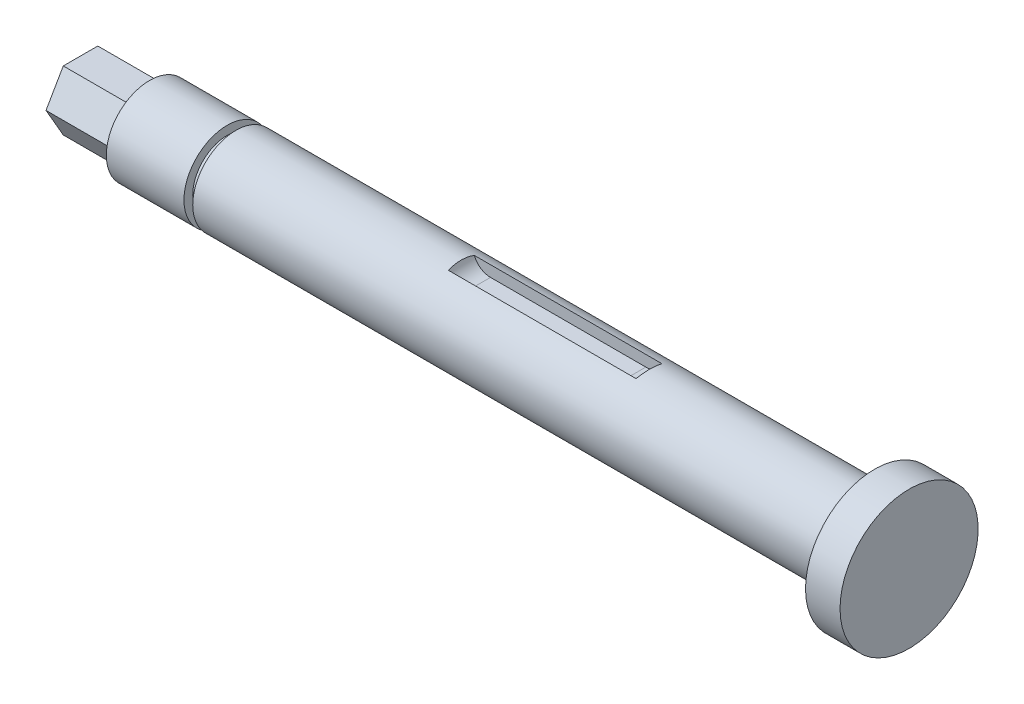
ISO-10303-21;
HEADER;
FILE_DESCRIPTION(('STEP AP214'),'2;1');
FILE_NAME('part.step','',(''),(''),'','','');
FILE_SCHEMA(('AUTOMOTIVE_DESIGN { 1 0 10303 214 1 1 1 1 }'));
ENDSEC;
DATA;
#1=APPLICATION_CONTEXT('core data for automotive mechanical design processes');
#2=APPLICATION_PROTOCOL_DEFINITION('international standard','automotive_design',2000,#1);
#3=PRODUCT_CONTEXT('',#1,'mechanical');
#4=PRODUCT('Part','Part','',(#3));
#5=PRODUCT_RELATED_PRODUCT_CATEGORY('part','',(#4));
#6=PRODUCT_DEFINITION_FORMATION('','',#4);
#7=PRODUCT_DEFINITION_CONTEXT('part definition',#1,'design');
#8=PRODUCT_DEFINITION('design','',#6,#7);
#9=PRODUCT_DEFINITION_SHAPE('','',#8);
#10=(LENGTH_UNIT() NAMED_UNIT(*) SI_UNIT(.MILLI.,.METRE.));
#11=(NAMED_UNIT(*) PLANE_ANGLE_UNIT() SI_UNIT($,.RADIAN.));
#12=(NAMED_UNIT(*) SI_UNIT($,.STERADIAN.) SOLID_ANGLE_UNIT());
#13=UNCERTAINTY_MEASURE_WITH_UNIT(LENGTH_MEASURE(1.E-05),#10,'distance_accuracy_value','');
#14=(GEOMETRIC_REPRESENTATION_CONTEXT(3) GLOBAL_UNCERTAINTY_ASSIGNED_CONTEXT((#13)) GLOBAL_UNIT_ASSIGNED_CONTEXT((#10,
#11,#12)) REPRESENTATION_CONTEXT('',''));
#15=CARTESIAN_POINT('',(0.,0.,0.));
#16=DIRECTION('',(0.,0.,1.));
#17=DIRECTION('',(1.,0.,0.));
#18=AXIS2_PLACEMENT_3D('',#15,#16,#17);
#19=CARTESIAN_POINT('',(-28.2307228915662,0.,0.));
#20=DIRECTION('',(-1.,0.,0.));
#21=DIRECTION('',(0.,0.,1.));
#22=AXIS2_PLACEMENT_3D('',#19,#20,#21);
#23=CYLINDRICAL_SURFACE('',#22,7.93750000000003);
#24=CARTESIAN_POINT('',(146.05,0.,0.));
#25=DIRECTION('',(-1.,0.,0.));
#26=DIRECTION('',(0.,0.,1.));
#27=AXIS2_PLACEMENT_3D('',#24,#25,#26);
#28=CIRCLE('',#27,7.93750000000004);
#29=CARTESIAN_POINT('',(146.05,0.,7.93750000000004));
#30=VERTEX_POINT('',#29);
#31=EDGE_CURVE('E196',#30,#30,#28,.T.);
#32=ORIENTED_EDGE('',*,*,#31,.T.);
#33=EDGE_LOOP('',(#32));
#34=FACE_BOUND('',#33,.T.);
#35=CARTESIAN_POINT('',(28.575,0.,0.));
#36=DIRECTION('',(-1.,0.,0.));
#37=DIRECTION('',(0.,0.,1.));
#38=AXIS2_PLACEMENT_3D('',#35,#36,#37);
#39=CIRCLE('',#38,7.93750000000002);
#40=CARTESIAN_POINT('',(28.575,0.,7.93750000000002));
#41=VERTEX_POINT('',#40);
#42=EDGE_CURVE('E193',#41,#41,#39,.T.);
#43=ORIENTED_EDGE('',*,*,#42,.F.);
#44=EDGE_LOOP('',(#43));
#45=FACE_BOUND('',#44,.T.);
#46=DIRECTION('',(-1.,0.,0.));
#47=VECTOR('',#46,1.);
#48=CARTESIAN_POINT('',(-28.2307228915662,7.57189241124704,-2.38125));
#49=LINE('',#48,#47);
#50=CARTESIAN_POINT('',(104.558242468135,7.57189241124704,-2.38125));
#51=VERTEX_POINT('',#50);
#52=CARTESIAN_POINT('',(70.0667575318649,7.57189241124704,-2.38125));
#53=VERTEX_POINT('',#52);
#54=EDGE_CURVE('E12',#51,#53,#49,.T.);
#55=ORIENTED_EDGE('',*,*,#54,.F.);
#56=CARTESIAN_POINT('',(104.558242468135,7.57189241124704,-2.38125));
#57=CARTESIAN_POINT('',(104.570292299634,7.60283748159564,-2.28286114644571));
#58=CARTESIAN_POINT('',(104.581072133761,7.63190103640769,-2.18373394589652));
#59=CARTESIAN_POINT('',(104.600423195045,7.68618284099059,-1.98423094459988));
#60=CARTESIAN_POINT('',(104.608994688707,7.71140155461099,-1.88385529605055));
#61=CARTESIAN_POINT('',(104.624259395623,7.75790730479952,-1.68210998868868));
#62=CARTESIAN_POINT('',(104.630953544207,7.77919629741936,-1.58074085099974));
#63=CARTESIAN_POINT('',(104.64273036696,7.81780480710205,-1.37716069329767));
#64=CARTESIAN_POINT('',(104.647812995253,7.83512421116127,-1.27494964940349));
#65=CARTESIAN_POINT('',(104.660759114225,7.8802878319986,-0.972518602068035));
#66=CARTESIAN_POINT('',(104.66668372953,7.90252061667358,-0.771346365920771));
#67=CARTESIAN_POINT('',(104.674320578914,7.93155475211322,-0.36781219202663));
#68=CARTESIAN_POINT('',(104.676032260968,7.9383540806034,-0.165450101853533));
#69=CARTESIAN_POINT('',(104.675557224375,7.93650243379862,0.233209512953251));
#70=CARTESIAN_POINT('',(104.673484295205,7.9283024201171,0.429509408207372));
#71=CARTESIAN_POINT('',(104.665305250642,7.89737846148742,0.820870390108015));
#72=CARTESIAN_POINT('',(104.659199841214,7.8746570588152,1.01593168756149));
#73=CARTESIAN_POINT('',(104.64615113362,7.82945029286185,1.30909544958883));
#74=CARTESIAN_POINT('',(104.641066118128,7.81224594563474,1.40812396106606));
#75=CARTESIAN_POINT('',(104.629359958228,7.77410905883624,1.60537279101093));
#76=CARTESIAN_POINT('',(104.622738856021,7.75317662169133,1.70359313160494));
#77=CARTESIAN_POINT('',(104.607714834745,7.7076215464084,1.89909267282387));
#78=CARTESIAN_POINT('',(104.599310976331,7.6829969648705,1.99637134891407));
#79=CARTESIAN_POINT('',(104.580417447224,7.63013554179117,2.18974831448237));
#80=CARTESIAN_POINT('',(104.569927539933,7.60189829063227,2.28584646875236));
#81=CARTESIAN_POINT('',(104.558242468135,7.57189241124704,2.38125));
#82=B_SPLINE_CURVE_WITH_KNOTS('',3,(#56,#57,#58,#59,#60,#61,#62,#63,#64,#65,#66,#67,#68,#69,#70,
#71,#72,#73,#74,#75,#76,#77,#78,#79,#80,#81),.UNSPECIFIED.,.F.,.F.,(4,2,2,2,2,2,2,2,2,2,2,2,4),
(0.,0.311486004627486,0.622934401155597,0.934227351103232,1.24552916163333,1.85227877141675,
2.45910788014202,3.04799138422072,3.63677182003086,3.93862384263225,4.24046757335365,
4.54247074416797,4.8445081875833),.UNSPECIFIED.);
#83=CARTESIAN_POINT('',(104.558242468135,7.57189241124704,2.38125));
#84=VERTEX_POINT('',#83);
#85=EDGE_CURVE('E46',#51,#84,#82,.T.);
#86=ORIENTED_EDGE('',*,*,#85,.T.);
#87=DIRECTION('',(-1.,0.,0.));
#88=VECTOR('',#87,1.);
#89=CARTESIAN_POINT('',(-28.2307228915662,7.57189241124704,2.38125));
#90=LINE('',#89,#88);
#91=CARTESIAN_POINT('',(70.0667575318649,7.57189241124704,2.38125));
#92=VERTEX_POINT('',#91);
#93=EDGE_CURVE('E205',#84,#92,#90,.T.);
#94=ORIENTED_EDGE('',*,*,#93,.T.);
#95=CARTESIAN_POINT('',(70.0667575318649,7.57189241124704,2.38125));
#96=CARTESIAN_POINT('',(70.0547077003656,7.60283748159564,2.2828611464457));
#97=CARTESIAN_POINT('',(70.0439278662388,7.63190103640769,2.18373394589652));
#98=CARTESIAN_POINT('',(70.0245768049551,7.68618284099059,1.98423094459987));
#99=CARTESIAN_POINT('',(70.0160053112933,7.71140155461099,1.88385529605055));
#100=CARTESIAN_POINT('',(70.0007406043774,7.75790730479952,1.68210998868868));
#101=CARTESIAN_POINT('',(69.9940464557926,7.77919629741936,1.58074085099974));
#102=CARTESIAN_POINT('',(69.9822696330403,7.81780480710205,1.37716069329767));
#103=CARTESIAN_POINT('',(69.9771870047471,7.83512421116127,1.27494964940349));
#104=CARTESIAN_POINT('',(69.9642408857745,7.8802878319986,0.972518602068035));
#105=CARTESIAN_POINT('',(69.9583162704699,7.90252061667358,0.771346365920772));
#106=CARTESIAN_POINT('',(69.9506794210857,7.93155475211322,0.367812192026633));
#107=CARTESIAN_POINT('',(69.9489677390323,7.93835408060341,0.165450101853536));
#108=CARTESIAN_POINT('',(69.949442775625,7.93650243379862,-0.233209512953248));
#109=CARTESIAN_POINT('',(69.9515157047947,7.9283024201171,-0.429509408207369));
#110=CARTESIAN_POINT('',(69.9596947493576,7.89737846148742,-0.820870390108013));
#111=CARTESIAN_POINT('',(69.9658001587861,7.8746570588152,-1.01593168756149));
#112=CARTESIAN_POINT('',(69.9788488663797,7.82945029286185,-1.30909544958883));
#113=CARTESIAN_POINT('',(69.9839338818715,7.81224594563474,-1.40812396106606));
#114=CARTESIAN_POINT('',(69.9956400417717,7.77410905883624,-1.60537279101094));
#115=CARTESIAN_POINT('',(70.0022611439788,7.75317662169133,-1.70359313160494));
#116=CARTESIAN_POINT('',(70.0172851652547,7.7076215464084,-1.89909267282387));
#117=CARTESIAN_POINT('',(70.0256890236686,7.6829969648705,-1.99637134891408));
#118=CARTESIAN_POINT('',(70.0445825527755,7.63013554179117,-2.18974831448237));
#119=CARTESIAN_POINT('',(70.0550724600671,7.60189829063227,-2.28584646875236));
#120=CARTESIAN_POINT('',(70.0667575318649,7.57189241124704,-2.38125));
#121=B_SPLINE_CURVE_WITH_KNOTS('',3,(#95,#96,#97,#98,#99,#100,#101,#102,#103,#104,#105,#106,
#107,#108,#109,#110,#111,#112,#113,#114,#115,#116,#117,#118,#119,#120),.UNSPECIFIED.,.F.,.F.,(4,
2,2,2,2,2,2,2,2,2,2,2,4),(0.,0.311486004627486,0.622934401155596,0.934227351103231,
1.24552916163333,1.85227877141675,2.45910788014201,3.04799138422072,3.63677182003086,
3.93862384263225,4.24046757335365,4.54247074416797,4.84450818758329),.UNSPECIFIED.);
#122=EDGE_CURVE('E208',#92,#53,#121,.T.);
#123=ORIENTED_EDGE('',*,*,#122,.T.);
#124=EDGE_LOOP('',(#55,#86,#94,#123));
#125=FACE_BOUND('',#124,.T.);
#126=ADVANCED_FACE('F38',(#34,#45,#125),#23,.T.);
#127=CARTESIAN_POINT('',(152.4,0.,0.));
#128=DIRECTION('',(-1.,0.,0.));
#129=DIRECTION('',(0.,0.,1.));
#130=AXIS2_PLACEMENT_3D('',#127,#128,#129);
#131=PLANE('',#130);
#132=CARTESIAN_POINT('',(152.4,0.,0.));
#133=DIRECTION('',(-1.,0.,0.));
#134=DIRECTION('',(0.,0.,1.));
#135=AXIS2_PLACEMENT_3D('',#132,#133,#134);
#136=CIRCLE('',#135,12.7);
#137=CARTESIAN_POINT('',(152.4,0.,12.7));
#138=VERTEX_POINT('',#137);
#139=EDGE_CURVE('E202',#138,#138,#136,.T.);
#140=ORIENTED_EDGE('',*,*,#139,.F.);
#141=EDGE_LOOP('',(#140));
#142=FACE_BOUND('',#141,.T.);
#143=ADVANCED_FACE('F256',(#142),#131,.F.);
#144=CARTESIAN_POINT('',(-28.2307228915662,0.,0.));
#145=DIRECTION('',(-1.,0.,0.));
#146=DIRECTION('',(0.,0.,1.));
#147=AXIS2_PLACEMENT_3D('',#144,#145,#146);
#148=CYLINDRICAL_SURFACE('',#147,12.7);
#149=CARTESIAN_POINT('',(146.05,0.,0.));
#150=DIRECTION('',(-1.,0.,0.));
#151=DIRECTION('',(0.,0.,1.));
#152=AXIS2_PLACEMENT_3D('',#149,#150,#151);
#153=CIRCLE('',#152,12.7);
#154=CARTESIAN_POINT('',(146.05,0.,12.7));
#155=VERTEX_POINT('',#154);
#156=EDGE_CURVE('E199',#155,#155,#153,.T.);
#157=ORIENTED_EDGE('',*,*,#156,.F.);
#158=EDGE_LOOP('',(#157));
#159=FACE_BOUND('',#158,.T.);
#160=ORIENTED_EDGE('',*,*,#139,.T.);
#161=EDGE_LOOP('',(#160));
#162=FACE_BOUND('',#161,.T.);
#163=ADVANCED_FACE('F251',(#159,#162),#148,.T.);
#164=CARTESIAN_POINT('',(146.05,12.7,0.));
#165=DIRECTION('',(1.,0.,0.));
#166=DIRECTION('',(0.,0.,-1.));
#167=AXIS2_PLACEMENT_3D('',#164,#165,#166);
#168=PLANE('',#167);
#169=ORIENTED_EDGE('',*,*,#31,.F.);
#170=EDGE_LOOP('',(#169));
#171=FACE_BOUND('',#170,.T.);
#172=ORIENTED_EDGE('',*,*,#156,.T.);
#173=EDGE_LOOP('',(#172));
#174=FACE_BOUND('',#173,.T.);
#175=ADVANCED_FACE('F246',(#171,#174),#168,.F.);
#176=CARTESIAN_POINT('',(28.575,7.93750000000002,0.));
#177=DIRECTION('',(1.,0.,0.));
#178=DIRECTION('',(0.,0.,-1.));
#179=AXIS2_PLACEMENT_3D('',#176,#177,#178);
#180=PLANE('',#179);
#181=CARTESIAN_POINT('',(28.575,0.,0.));
#182=DIRECTION('',(-1.,0.,0.));
#183=DIRECTION('',(0.,0.,1.));
#184=AXIS2_PLACEMENT_3D('',#181,#182,#183);
#185=CIRCLE('',#184,6.33730000000002);
#186=CARTESIAN_POINT('',(28.575,0.,6.33730000000002));
#187=VERTEX_POINT('',#186);
#188=EDGE_CURVE('E190',#187,#187,#185,.T.);
#189=ORIENTED_EDGE('',*,*,#188,.F.);
#190=EDGE_LOOP('',(#189));
#191=FACE_BOUND('',#190,.T.);
#192=ORIENTED_EDGE('',*,*,#42,.T.);
#193=EDGE_LOOP('',(#192));
#194=FACE_BOUND('',#193,.T.);
#195=ADVANCED_FACE('F243',(#191,#194),#180,.F.);
#196=CARTESIAN_POINT('',(-28.2307228915662,0.,0.));
#197=DIRECTION('',(-1.,0.,0.));
#198=DIRECTION('',(0.,0.,1.));
#199=AXIS2_PLACEMENT_3D('',#196,#197,#198);
#200=CYLINDRICAL_SURFACE('',#199,6.33730000000002);
#201=CARTESIAN_POINT('',(26.9748,0.,0.));
#202=DIRECTION('',(-1.,0.,0.));
#203=DIRECTION('',(0.,0.,1.));
#204=AXIS2_PLACEMENT_3D('',#201,#202,#203);
#205=CIRCLE('',#204,6.33730000000002);
#206=CARTESIAN_POINT('',(26.9748,0.,6.33730000000002));
#207=VERTEX_POINT('',#206);
#208=EDGE_CURVE('E187',#207,#207,#205,.T.);
#209=ORIENTED_EDGE('',*,*,#208,.F.);
#210=EDGE_LOOP('',(#209));
#211=FACE_BOUND('',#210,.T.);
#212=ORIENTED_EDGE('',*,*,#188,.T.);
#213=EDGE_LOOP('',(#212));
#214=FACE_BOUND('',#213,.T.);
#215=ADVANCED_FACE('F240',(#211,#214),#200,.T.);
#216=CARTESIAN_POINT('',(26.9748,6.33730000000002,0.));
#217=DIRECTION('',(-1.,0.,0.));
#218=DIRECTION('',(0.,0.,1.));
#219=AXIS2_PLACEMENT_3D('',#216,#217,#218);
#220=PLANE('',#219);
#221=CARTESIAN_POINT('',(26.9748,0.,0.));
#222=DIRECTION('',(-1.,0.,0.));
#223=DIRECTION('',(0.,0.,1.));
#224=AXIS2_PLACEMENT_3D('',#221,#222,#223);
#225=CIRCLE('',#224,7.95020000000001);
#226=CARTESIAN_POINT('',(26.9748,0.,7.95020000000001));
#227=VERTEX_POINT('',#226);
#228=EDGE_CURVE('E184',#227,#227,#225,.T.);
#229=ORIENTED_EDGE('',*,*,#228,.F.);
#230=EDGE_LOOP('',(#229));
#231=FACE_BOUND('',#230,.T.);
#232=ORIENTED_EDGE('',*,*,#208,.T.);
#233=EDGE_LOOP('',(#232));
#234=FACE_BOUND('',#233,.T.);
#235=ADVANCED_FACE('F236',(#231,#234),#220,.F.);
#236=CARTESIAN_POINT('',(-28.2307228915662,0.,0.));
#237=DIRECTION('',(-1.,0.,0.));
#238=DIRECTION('',(0.,0.,1.));
#239=AXIS2_PLACEMENT_3D('',#236,#237,#238);
#240=CYLINDRICAL_SURFACE('',#239,7.9502);
#241=CARTESIAN_POINT('',(12.7,0.,0.));
#242=DIRECTION('',(-1.,0.,0.));
#243=DIRECTION('',(0.,0.,1.));
#244=AXIS2_PLACEMENT_3D('',#241,#242,#243);
#245=CIRCLE('',#244,7.9502);
#246=CARTESIAN_POINT('',(12.7,0.,7.9502));
#247=VERTEX_POINT('',#246);
#248=EDGE_CURVE('E179',#247,#247,#245,.T.);
#249=ORIENTED_EDGE('',*,*,#248,.F.);
#250=EDGE_LOOP('',(#249));
#251=FACE_BOUND('',#250,.T.);
#252=ORIENTED_EDGE('',*,*,#228,.T.);
#253=EDGE_LOOP('',(#252));
#254=FACE_BOUND('',#253,.T.);
#255=ADVANCED_FACE('F233',(#251,#254),#240,.T.);
#256=CARTESIAN_POINT('',(12.7,7.9502,0.));
#257=DIRECTION('',(1.,0.,0.));
#258=DIRECTION('',(0.,0.,-1.));
#259=AXIS2_PLACEMENT_3D('',#256,#257,#258);
#260=PLANE('',#259);
#261=DIRECTION('',(0.,-0.866025403784438,0.5));
#262=VECTOR('',#261,1.);
#263=CARTESIAN_POINT('',(12.7,0.,-6.35));
#264=LINE('',#263,#262);
#265=CARTESIAN_POINT('',(12.7,0.,-6.35));
#266=VERTEX_POINT('',#265);
#267=CARTESIAN_POINT('',(12.7,-5.49926131403118,-3.175));
#268=VERTEX_POINT('',#267);
#269=EDGE_CURVE('E145',#266,#268,#264,.T.);
#270=ORIENTED_EDGE('',*,*,#269,.F.);
#271=DIRECTION('',(0.,-0.866025403784439,-0.5));
#272=VECTOR('',#271,1.);
#273=CARTESIAN_POINT('',(12.7,5.49926131403118,-3.175));
#274=LINE('',#273,#272);
#275=CARTESIAN_POINT('',(12.7,5.49926131403118,-3.175));
#276=VERTEX_POINT('',#275);
#277=EDGE_CURVE('E53',#276,#266,#274,.T.);
#278=ORIENTED_EDGE('',*,*,#277,.F.);
#279=DIRECTION('',(0.,0.,-1.));
#280=VECTOR('',#279,1.);
#281=CARTESIAN_POINT('',(12.7,5.49926131403118,3.175));
#282=LINE('',#281,#280);
#283=CARTESIAN_POINT('',(12.7,5.49926131403118,3.175));
#284=VERTEX_POINT('',#283);
#285=EDGE_CURVE('E116',#284,#276,#282,.T.);
#286=ORIENTED_EDGE('',*,*,#285,.F.);
#287=DIRECTION('',(0.,0.866025403784438,-0.5));
#288=VECTOR('',#287,1.);
#289=CARTESIAN_POINT('',(12.7,0.,6.35));
#290=LINE('',#289,#288);
#291=CARTESIAN_POINT('',(12.7,0.,6.35));
#292=VERTEX_POINT('',#291);
#293=EDGE_CURVE('E128',#292,#284,#290,.T.);
#294=ORIENTED_EDGE('',*,*,#293,.F.);
#295=DIRECTION('',(0.,0.866025403784439,0.5));
#296=VECTOR('',#295,1.);
#297=CARTESIAN_POINT('',(12.7,-5.49926131403118,3.175));
#298=LINE('',#297,#296);
#299=CARTESIAN_POINT('',(12.7,-5.49926131403118,3.175));
#300=VERTEX_POINT('',#299);
#301=EDGE_CURVE('E134',#300,#292,#298,.T.);
#302=ORIENTED_EDGE('',*,*,#301,.F.);
#303=DIRECTION('',(0.,0.,1.));
#304=VECTOR('',#303,1.);
#305=CARTESIAN_POINT('',(12.7,-5.49926131403118,-3.175));
#306=LINE('',#305,#304);
#307=EDGE_CURVE('E141',#268,#300,#306,.T.);
#308=ORIENTED_EDGE('',*,*,#307,.F.);
#309=EDGE_LOOP('',(#270,#278,#286,#294,#302,#308));
#310=FACE_BOUND('',#309,.T.);
#311=ORIENTED_EDGE('',*,*,#248,.T.);
#312=EDGE_LOOP('',(#311));
#313=FACE_BOUND('',#312,.T.);
#314=ADVANCED_FACE('F126',(#310,#313),#260,.F.);
#315=CARTESIAN_POINT('',(101.6,8.72490000000003,-2.38125));
#316=DIRECTION('',(0.,0.,1.));
#317=DIRECTION('',(1.,0.,0.));
#318=AXIS2_PLACEMENT_3D('',#315,#316,#317);
#319=CYLINDRICAL_SURFACE('',#318,3.175);
#320=CARTESIAN_POINT('',(101.6,8.72490000000003,-2.38125));
#321=DIRECTION('',(0.,0.,1.));
#322=DIRECTION('',(-1.,0.,0.));
#323=AXIS2_PLACEMENT_3D('',#320,#321,#322);
#324=CIRCLE('',#323,3.175);
#325=CARTESIAN_POINT('',(101.6,5.54990000000003,-2.38125));
#326=VERTEX_POINT('',#325);
#327=EDGE_CURVE('E167',#326,#51,#324,.T.);
#328=ORIENTED_EDGE('',*,*,#327,.F.);
#329=DIRECTION('',(0.,0.,1.));
#330=VECTOR('',#329,1.);
#331=CARTESIAN_POINT('',(101.6,5.54990000000003,-2.38125));
#332=LINE('',#331,#330);
#333=CARTESIAN_POINT('',(101.6,5.54990000000003,2.38125));
#334=VERTEX_POINT('',#333);
#335=EDGE_CURVE('E177',#326,#334,#332,.T.);
#336=ORIENTED_EDGE('',*,*,#335,.T.);
#337=CARTESIAN_POINT('',(101.6,8.72490000000003,2.38125));
#338=DIRECTION('',(0.,0.,1.));
#339=DIRECTION('',(-1.,0.,0.));
#340=AXIS2_PLACEMENT_3D('',#337,#338,#339);
#341=CIRCLE('',#340,3.175);
#342=EDGE_CURVE('E164',#334,#84,#341,.T.);
#343=ORIENTED_EDGE('',*,*,#342,.T.);
#344=ORIENTED_EDGE('',*,*,#85,.F.);
#345=EDGE_LOOP('',(#328,#336,#343,#344));
#346=FACE_BOUND('',#345,.T.);
#347=ADVANCED_FACE('F228',(#346),#319,.F.);
#348=CARTESIAN_POINT('',(73.025,8.72490000000003,-2.38125));
#349=DIRECTION('',(0.,0.,1.));
#350=DIRECTION('',(1.,0.,0.));
#351=AXIS2_PLACEMENT_3D('',#348,#349,#350);
#352=CYLINDRICAL_SURFACE('',#351,3.17500000000001);
#353=CARTESIAN_POINT('',(73.025,8.72490000000003,2.38125));
#354=DIRECTION('',(0.,0.,1.));
#355=DIRECTION('',(1.,0.,0.));
#356=AXIS2_PLACEMENT_3D('',#353,#354,#355);
#357=CIRCLE('',#356,3.17500000000001);
#358=CARTESIAN_POINT('',(73.025,5.54990000000003,2.38125));
#359=VERTEX_POINT('',#358);
#360=EDGE_CURVE('E144',#92,#359,#357,.T.);
#361=ORIENTED_EDGE('',*,*,#360,.T.);
#362=DIRECTION('',(0.,0.,1.));
#363=VECTOR('',#362,1.);
#364=CARTESIAN_POINT('',(73.025,5.54990000000003,-2.38125));
#365=LINE('',#364,#363);
#366=CARTESIAN_POINT('',(73.025,5.54990000000003,-2.38125));
#367=VERTEX_POINT('',#366);
#368=EDGE_CURVE('E170',#367,#359,#365,.T.);
#369=ORIENTED_EDGE('',*,*,#368,.F.);
#370=CARTESIAN_POINT('',(73.025,8.72490000000003,-2.38125));
#371=DIRECTION('',(0.,0.,1.));
#372=DIRECTION('',(1.,0.,0.));
#373=AXIS2_PLACEMENT_3D('',#370,#371,#372);
#374=CIRCLE('',#373,3.17500000000001);
#375=EDGE_CURVE('E161',#53,#367,#374,.T.);
#376=ORIENTED_EDGE('',*,*,#375,.F.);
#377=ORIENTED_EDGE('',*,*,#122,.F.);
#378=EDGE_LOOP('',(#361,#369,#376,#377));
#379=FACE_BOUND('',#378,.T.);
#380=ADVANCED_FACE('F222',(#379),#352,.F.);
#381=CARTESIAN_POINT('',(73.025,8.72490000000003,-2.38125));
#382=DIRECTION('',(0.,0.,1.));
#383=DIRECTION('',(1.,0.,0.));
#384=AXIS2_PLACEMENT_3D('',#381,#382,#383);
#385=PLANE('',#384);
#386=ORIENTED_EDGE('',*,*,#54,.T.);
#387=ORIENTED_EDGE('',*,*,#375,.T.);
#388=DIRECTION('',(1.,0.,0.));
#389=VECTOR('',#388,1.);
#390=CARTESIAN_POINT('',(101.6,5.54990000000003,-2.38125));
#391=LINE('',#390,#389);
#392=EDGE_CURVE('E163',#367,#326,#391,.T.);
#393=ORIENTED_EDGE('',*,*,#392,.T.);
#394=ORIENTED_EDGE('',*,*,#327,.T.);
#395=EDGE_LOOP('',(#386,#387,#393,#394));
#396=FACE_BOUND('',#395,.T.);
#397=ADVANCED_FACE('F227',(#396),#385,.T.);
#398=CARTESIAN_POINT('',(73.025,8.72490000000003,2.38125));
#399=DIRECTION('',(0.,0.,1.));
#400=DIRECTION('',(1.,0.,0.));
#401=AXIS2_PLACEMENT_3D('',#398,#399,#400);
#402=PLANE('',#401);
#403=ORIENTED_EDGE('',*,*,#342,.F.);
#404=DIRECTION('',(1.,0.,0.));
#405=VECTOR('',#404,1.);
#406=CARTESIAN_POINT('',(101.6,5.54990000000003,2.38125));
#407=LINE('',#406,#405);
#408=EDGE_CURVE('E172',#359,#334,#407,.T.);
#409=ORIENTED_EDGE('',*,*,#408,.F.);
#410=ORIENTED_EDGE('',*,*,#360,.F.);
#411=ORIENTED_EDGE('',*,*,#93,.F.);
#412=EDGE_LOOP('',(#403,#409,#410,#411));
#413=FACE_BOUND('',#412,.T.);
#414=ADVANCED_FACE('F279',(#413),#402,.F.);
#415=CARTESIAN_POINT('',(101.6,5.54990000000003,-2.38125));
#416=DIRECTION('',(0.,-1.,0.));
#417=DIRECTION('',(0.,0.,-1.));
#418=AXIS2_PLACEMENT_3D('',#415,#416,#417);
#419=PLANE('',#418);
#420=ORIENTED_EDGE('',*,*,#408,.T.);
#421=ORIENTED_EDGE('',*,*,#335,.F.);
#422=ORIENTED_EDGE('',*,*,#392,.F.);
#423=ORIENTED_EDGE('',*,*,#368,.T.);
#424=EDGE_LOOP('',(#420,#421,#422,#423));
#425=FACE_BOUND('',#424,.T.);
#426=ADVANCED_FACE('F230',(#425),#419,.F.);
#427=CARTESIAN_POINT('',(56.5795209628124,0.,6.35));
#428=DIRECTION('',(0.,0.5,0.866025403784438));
#429=DIRECTION('',(0.,-0.866025403784438,0.5));
#430=AXIS2_PLACEMENT_3D('',#427,#428,#429);
#431=PLANE('',#430);
#432=ORIENTED_EDGE('',*,*,#293,.T.);
#433=DIRECTION('',(-1.,0.,0.));
#434=VECTOR('',#433,1.);
#435=CARTESIAN_POINT('',(56.5795209628124,5.49926131403118,3.175));
#436=LINE('',#435,#434);
#437=CARTESIAN_POINT('',(0.,5.49926131403118,3.175));
#438=VERTEX_POINT('',#437);
#439=EDGE_CURVE('E113',#284,#438,#436,.T.);
#440=ORIENTED_EDGE('',*,*,#439,.T.);
#441=DIRECTION('',(0.,0.866025403784438,-0.5));
#442=VECTOR('',#441,1.);
#443=CARTESIAN_POINT('',(0.,0.,6.35));
#444=LINE('',#443,#442);
#445=CARTESIAN_POINT('',(0.,0.,6.35));
#446=VERTEX_POINT('',#445);
#447=EDGE_CURVE('E138',#446,#438,#444,.T.);
#448=ORIENTED_EDGE('',*,*,#447,.F.);
#449=DIRECTION('',(-1.,0.,0.));
#450=VECTOR('',#449,1.);
#451=CARTESIAN_POINT('',(56.5795209628124,0.,6.35));
#452=LINE('',#451,#450);
#453=EDGE_CURVE('E132',#292,#446,#452,.T.);
#454=ORIENTED_EDGE('',*,*,#453,.F.);
#455=EDGE_LOOP('',(#432,#440,#448,#454));
#456=FACE_BOUND('',#455,.T.);
#457=ADVANCED_FACE('F131',(#456),#431,.T.);
#458=CARTESIAN_POINT('',(56.5795209628124,-5.49926131403118,3.175));
#459=DIRECTION('',(0.,-0.5,0.866025403784439));
#460=DIRECTION('',(0.,-0.866025403784439,-0.5));
#461=AXIS2_PLACEMENT_3D('',#458,#459,#460);
#462=PLANE('',#461);
#463=ORIENTED_EDGE('',*,*,#301,.T.);
#464=ORIENTED_EDGE('',*,*,#453,.T.);
#465=DIRECTION('',(0.,0.866025403784439,0.5));
#466=VECTOR('',#465,1.);
#467=CARTESIAN_POINT('',(0.,-5.49926131403118,3.175));
#468=LINE('',#467,#466);
#469=CARTESIAN_POINT('',(0.,-5.49926131403118,3.175));
#470=VERTEX_POINT('',#469);
#471=EDGE_CURVE('E152',#470,#446,#468,.T.);
#472=ORIENTED_EDGE('',*,*,#471,.F.);
#473=DIRECTION('',(-1.,0.,0.));
#474=VECTOR('',#473,1.);
#475=CARTESIAN_POINT('',(56.5795209628124,-5.49926131403118,3.175));
#476=LINE('',#475,#474);
#477=EDGE_CURVE('E150',#300,#470,#476,.T.);
#478=ORIENTED_EDGE('',*,*,#477,.F.);
#479=EDGE_LOOP('',(#463,#464,#472,#478));
#480=FACE_BOUND('',#479,.T.);
#481=ADVANCED_FACE('F327',(#480),#462,.T.);
#482=CARTESIAN_POINT('',(56.5795209628124,-5.49926131403118,-3.175));
#483=DIRECTION('',(0.,-1.,0.));
#484=DIRECTION('',(0.,0.,-1.));
#485=AXIS2_PLACEMENT_3D('',#482,#483,#484);
#486=PLANE('',#485);
#487=ORIENTED_EDGE('',*,*,#307,.T.);
#488=ORIENTED_EDGE('',*,*,#477,.T.);
#489=DIRECTION('',(0.,0.,1.));
#490=VECTOR('',#489,1.);
#491=CARTESIAN_POINT('',(0.,-5.49926131403118,-3.175));
#492=LINE('',#491,#490);
#493=CARTESIAN_POINT('',(0.,-5.49926131403118,-3.175));
#494=VERTEX_POINT('',#493);
#495=EDGE_CURVE('E155',#494,#470,#492,.T.);
#496=ORIENTED_EDGE('',*,*,#495,.F.);
#497=DIRECTION('',(-1.,0.,0.));
#498=VECTOR('',#497,1.);
#499=CARTESIAN_POINT('',(56.5795209628124,-5.49926131403118,-3.175));
#500=LINE('',#499,#498);
#501=EDGE_CURVE('E153',#268,#494,#500,.T.);
#502=ORIENTED_EDGE('',*,*,#501,.F.);
#503=EDGE_LOOP('',(#487,#488,#496,#502));
#504=FACE_BOUND('',#503,.T.);
#505=ADVANCED_FACE('F335',(#504),#486,.T.);
#506=CARTESIAN_POINT('',(56.5795209628124,0.,-6.35));
#507=DIRECTION('',(0.,-0.5,-0.866025403784438));
#508=DIRECTION('',(0.,0.866025403784438,-0.5));
#509=AXIS2_PLACEMENT_3D('',#506,#507,#508);
#510=PLANE('',#509);
#511=ORIENTED_EDGE('',*,*,#269,.T.);
#512=ORIENTED_EDGE('',*,*,#501,.T.);
#513=DIRECTION('',(0.,-0.866025403784438,0.5));
#514=VECTOR('',#513,1.);
#515=CARTESIAN_POINT('',(0.,0.,-6.35));
#516=LINE('',#515,#514);
#517=CARTESIAN_POINT('',(0.,0.,-6.35));
#518=VERTEX_POINT('',#517);
#519=EDGE_CURVE('E158',#518,#494,#516,.T.);
#520=ORIENTED_EDGE('',*,*,#519,.F.);
#521=DIRECTION('',(-1.,0.,0.));
#522=VECTOR('',#521,1.);
#523=CARTESIAN_POINT('',(56.5795209628124,0.,-6.35));
#524=LINE('',#523,#522);
#525=EDGE_CURVE('E156',#266,#518,#524,.T.);
#526=ORIENTED_EDGE('',*,*,#525,.F.);
#527=EDGE_LOOP('',(#511,#512,#520,#526));
#528=FACE_BOUND('',#527,.T.);
#529=ADVANCED_FACE('F345',(#528),#510,.T.);
#530=CARTESIAN_POINT('',(56.5795209628124,5.49926131403118,-3.175));
#531=DIRECTION('',(0.,0.5,-0.866025403784439));
#532=DIRECTION('',(0.,0.866025403784439,0.5));
#533=AXIS2_PLACEMENT_3D('',#530,#531,#532);
#534=PLANE('',#533);
#535=ORIENTED_EDGE('',*,*,#277,.T.);
#536=ORIENTED_EDGE('',*,*,#525,.T.);
#537=DIRECTION('',(0.,-0.866025403784439,-0.5));
#538=VECTOR('',#537,1.);
#539=CARTESIAN_POINT('',(0.,5.49926131403118,-3.175));
#540=LINE('',#539,#538);
#541=CARTESIAN_POINT('',(0.,5.49926131403118,-3.175));
#542=VERTEX_POINT('',#541);
#543=EDGE_CURVE('E58',#542,#518,#540,.T.);
#544=ORIENTED_EDGE('',*,*,#543,.F.);
#545=DIRECTION('',(-1.,0.,0.));
#546=VECTOR('',#545,1.);
#547=CARTESIAN_POINT('',(56.5795209628124,5.49926131403118,-3.175));
#548=LINE('',#547,#546);
#549=EDGE_CURVE('E159',#276,#542,#548,.T.);
#550=ORIENTED_EDGE('',*,*,#549,.F.);
#551=EDGE_LOOP('',(#535,#536,#544,#550));
#552=FACE_BOUND('',#551,.T.);
#553=ADVANCED_FACE('F355',(#552),#534,.T.);
#554=CARTESIAN_POINT('',(56.5795209628124,5.49926131403118,3.175));
#555=DIRECTION('',(0.,1.,0.));
#556=DIRECTION('',(0.,0.,1.));
#557=AXIS2_PLACEMENT_3D('',#554,#555,#556);
#558=PLANE('',#557);
#559=ORIENTED_EDGE('',*,*,#285,.T.);
#560=ORIENTED_EDGE('',*,*,#549,.T.);
#561=DIRECTION('',(0.,0.,-1.));
#562=VECTOR('',#561,1.);
#563=CARTESIAN_POINT('',(0.,5.49926131403118,3.175));
#564=LINE('',#563,#562);
#565=EDGE_CURVE('E118',#438,#542,#564,.T.);
#566=ORIENTED_EDGE('',*,*,#565,.F.);
#567=ORIENTED_EDGE('',*,*,#439,.F.);
#568=EDGE_LOOP('',(#559,#560,#566,#567));
#569=FACE_BOUND('',#568,.T.);
#570=ADVANCED_FACE('F115',(#569),#558,.T.);
#571=CARTESIAN_POINT('',(0.,6.35,0.));
#572=DIRECTION('',(1.,0.,0.));
#573=DIRECTION('',(0.,0.,-1.));
#574=AXIS2_PLACEMENT_3D('',#571,#572,#573);
#575=PLANE('',#574);
#576=ORIENTED_EDGE('',*,*,#447,.T.);
#577=ORIENTED_EDGE('',*,*,#565,.T.);
#578=ORIENTED_EDGE('',*,*,#543,.T.);
#579=ORIENTED_EDGE('',*,*,#519,.T.);
#580=ORIENTED_EDGE('',*,*,#495,.T.);
#581=ORIENTED_EDGE('',*,*,#471,.T.);
#582=EDGE_LOOP('',(#576,#577,#578,#579,#580,#581));
#583=FACE_BOUND('',#582,.T.);
#584=ADVANCED_FACE('F40',(#583),#575,.F.);
#585=CLOSED_SHELL('',(#126,#143,#163,#175,#195,#215,#235,#255,#314,#347,#380,#397,#414,#426,
#457,#481,#505,#529,#553,#570,#584));
#586=MANIFOLD_SOLID_BREP('B2',#585);
#587=ADVANCED_BREP_SHAPE_REPRESENTATION('',(#18,#586),#14);
#588=SHAPE_DEFINITION_REPRESENTATION(#9,#587);
ENDSEC;
END-ISO-10303-21;
